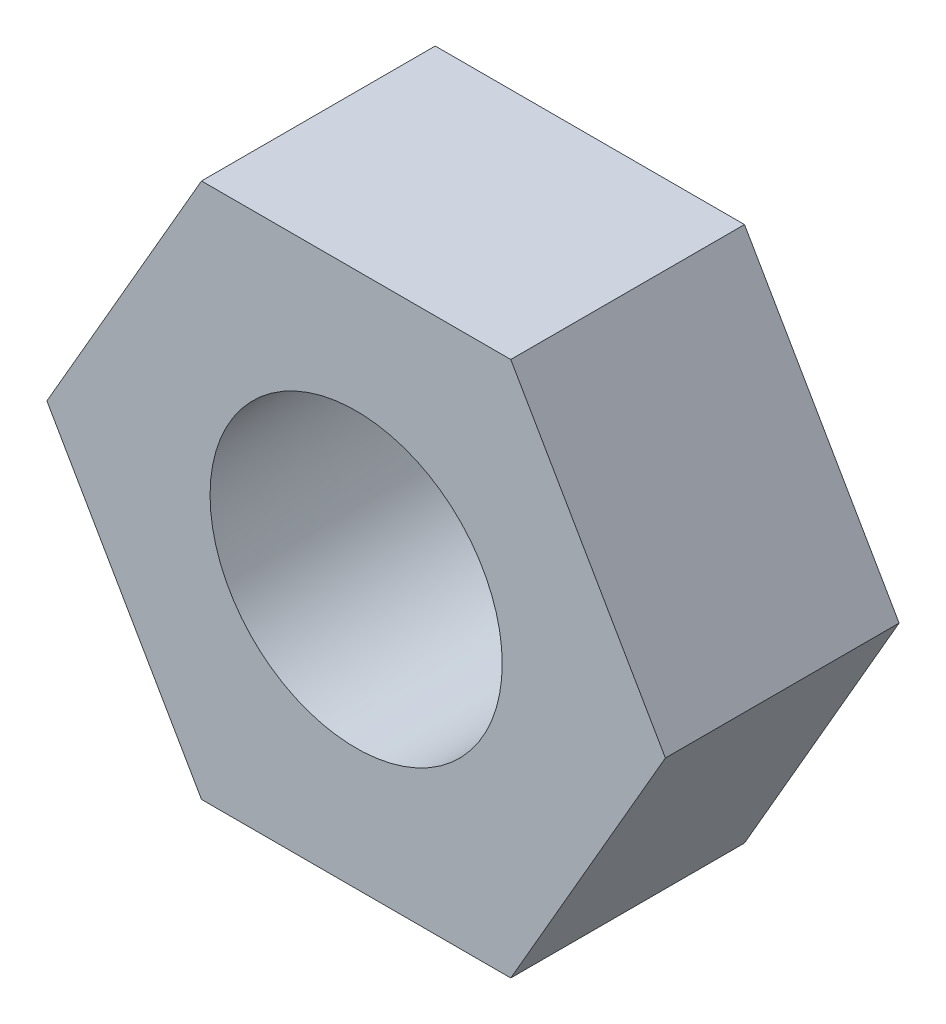
ISO-10303-21;
HEADER;
FILE_DESCRIPTION(('STEP AP214'),'2;1');
FILE_NAME('part.step','',(''),(''),'','','');
FILE_SCHEMA(('AUTOMOTIVE_DESIGN { 1 0 10303 214 1 1 1 1 }'));
ENDSEC;
DATA;
#1=APPLICATION_CONTEXT('core data for automotive mechanical design processes');
#2=APPLICATION_PROTOCOL_DEFINITION('international standard','automotive_design',2000,#1);
#3=PRODUCT_CONTEXT('',#1,'mechanical');
#4=PRODUCT('Part','Part','',(#3));
#5=PRODUCT_RELATED_PRODUCT_CATEGORY('part','',(#4));
#6=PRODUCT_DEFINITION_FORMATION('','',#4);
#7=PRODUCT_DEFINITION_CONTEXT('part definition',#1,'design');
#8=PRODUCT_DEFINITION('design','',#6,#7);
#9=PRODUCT_DEFINITION_SHAPE('','',#8);
#10=(LENGTH_UNIT() NAMED_UNIT(*) SI_UNIT(.MILLI.,.METRE.));
#11=(NAMED_UNIT(*) PLANE_ANGLE_UNIT() SI_UNIT($,.RADIAN.));
#12=(NAMED_UNIT(*) SI_UNIT($,.STERADIAN.) SOLID_ANGLE_UNIT());
#13=UNCERTAINTY_MEASURE_WITH_UNIT(LENGTH_MEASURE(1.E-05),#10,'distance_accuracy_value','');
#14=(GEOMETRIC_REPRESENTATION_CONTEXT(3) GLOBAL_UNCERTAINTY_ASSIGNED_CONTEXT((#13)) GLOBAL_UNIT_ASSIGNED_CONTEXT((#10,
#11,#12)) REPRESENTATION_CONTEXT('',''));
#15=CARTESIAN_POINT('',(0.,0.,0.));
#16=DIRECTION('',(0.,0.,1.));
#17=DIRECTION('',(1.,0.,0.));
#18=AXIS2_PLACEMENT_3D('',#15,#16,#17);
#19=CARTESIAN_POINT('',(0.,0.,2.4));
#20=DIRECTION('',(0.,0.,1.));
#21=DIRECTION('',(1.,0.,0.));
#22=AXIS2_PLACEMENT_3D('',#19,#20,#21);
#23=PLANE('',#22);
#24=DIRECTION('',(0.5,0.866025403784439,0.));
#25=VECTOR('',#24,1.);
#26=CARTESIAN_POINT('',(1.58771324027147,-2.75,2.4));
#27=LINE('',#26,#25);
#28=CARTESIAN_POINT('',(1.58771324027147,-2.75,2.4));
#29=VERTEX_POINT('',#28);
#30=CARTESIAN_POINT('',(3.17542648054294,0.,2.4));
#31=VERTEX_POINT('',#30);
#32=EDGE_CURVE('E134',#29,#31,#27,.T.);
#33=ORIENTED_EDGE('',*,*,#32,.T.);
#34=DIRECTION('',(-0.5,0.866025403784439,0.));
#35=VECTOR('',#34,1.);
#36=CARTESIAN_POINT('',(3.17542648054294,0.,2.4));
#37=LINE('',#36,#35);
#38=CARTESIAN_POINT('',(1.58771324027147,2.75,2.4));
#39=VERTEX_POINT('',#38);
#40=EDGE_CURVE('E93',#31,#39,#37,.T.);
#41=ORIENTED_EDGE('',*,*,#40,.T.);
#42=DIRECTION('',(-1.,0.,0.));
#43=VECTOR('',#42,1.);
#44=CARTESIAN_POINT('',(1.58771324027147,2.75,2.4));
#45=LINE('',#44,#43);
#46=CARTESIAN_POINT('',(-1.58771324027147,2.75,2.4));
#47=VERTEX_POINT('',#46);
#48=EDGE_CURVE('E106',#39,#47,#45,.T.);
#49=ORIENTED_EDGE('',*,*,#48,.T.);
#50=DIRECTION('',(-0.5,-0.866025403784438,0.));
#51=VECTOR('',#50,1.);
#52=CARTESIAN_POINT('',(-1.58771324027147,2.75,2.4));
#53=LINE('',#52,#51);
#54=CARTESIAN_POINT('',(-3.17542648054294,0.,2.4));
#55=VERTEX_POINT('',#54);
#56=EDGE_CURVE('E99',#47,#55,#53,.T.);
#57=ORIENTED_EDGE('',*,*,#56,.T.);
#58=DIRECTION('',(0.5,-0.866025403784439,0.));
#59=VECTOR('',#58,1.);
#60=CARTESIAN_POINT('',(-3.17542648054294,0.,2.4));
#61=LINE('',#60,#59);
#62=CARTESIAN_POINT('',(-1.58771324027147,-2.75,2.4));
#63=VERTEX_POINT('',#62);
#64=EDGE_CURVE('E101',#55,#63,#61,.T.);
#65=ORIENTED_EDGE('',*,*,#64,.T.);
#66=DIRECTION('',(1.,0.,0.));
#67=VECTOR('',#66,1.);
#68=CARTESIAN_POINT('',(-1.58771324027147,-2.75,2.4));
#69=LINE('',#68,#67);
#70=EDGE_CURVE('E57',#63,#29,#69,.T.);
#71=ORIENTED_EDGE('',*,*,#70,.T.);
#72=EDGE_LOOP('',(#33,#41,#49,#57,#65,#71));
#73=FACE_BOUND('',#72,.T.);
#74=CARTESIAN_POINT('',(0.,0.,2.4));
#75=DIRECTION('',(0.,0.,1.));
#76=DIRECTION('',(1.,0.,0.));
#77=AXIS2_PLACEMENT_3D('',#74,#75,#76);
#78=CIRCLE('',#77,1.5);
#79=CARTESIAN_POINT('',(1.5,0.,2.4));
#80=VERTEX_POINT('',#79);
#81=EDGE_CURVE('E126',#80,#80,#78,.T.);
#82=ORIENTED_EDGE('',*,*,#81,.F.);
#83=EDGE_LOOP('',(#82));
#84=FACE_BOUND('',#83,.T.);
#85=ADVANCED_FACE('F39',(#73,#84),#23,.T.);
#86=CARTESIAN_POINT('',(0.,0.,0.));
#87=DIRECTION('',(0.,0.,1.));
#88=DIRECTION('',(1.,0.,0.));
#89=AXIS2_PLACEMENT_3D('',#86,#87,#88);
#90=PLANE('',#89);
#91=DIRECTION('',(0.5,0.866025403784439,0.));
#92=VECTOR('',#91,1.);
#93=CARTESIAN_POINT('',(1.58771324027147,-2.75,0.));
#94=LINE('',#93,#92);
#95=CARTESIAN_POINT('',(1.58771324027147,-2.75,0.));
#96=VERTEX_POINT('',#95);
#97=CARTESIAN_POINT('',(3.17542648054294,0.,0.));
#98=VERTEX_POINT('',#97);
#99=EDGE_CURVE('E125',#96,#98,#94,.T.);
#100=ORIENTED_EDGE('',*,*,#99,.F.);
#101=DIRECTION('',(1.,0.,0.));
#102=VECTOR('',#101,1.);
#103=CARTESIAN_POINT('',(-1.58771324027147,-2.75,0.));
#104=LINE('',#103,#102);
#105=CARTESIAN_POINT('',(-1.58771324027147,-2.75,0.));
#106=VERTEX_POINT('',#105);
#107=EDGE_CURVE('E82',#106,#96,#104,.T.);
#108=ORIENTED_EDGE('',*,*,#107,.F.);
#109=DIRECTION('',(0.5,-0.866025403784439,0.));
#110=VECTOR('',#109,1.);
#111=CARTESIAN_POINT('',(-3.17542648054294,0.,0.));
#112=LINE('',#111,#110);
#113=CARTESIAN_POINT('',(-3.17542648054294,0.,0.));
#114=VERTEX_POINT('',#113);
#115=EDGE_CURVE('E80',#114,#106,#112,.T.);
#116=ORIENTED_EDGE('',*,*,#115,.F.);
#117=DIRECTION('',(-0.5,-0.866025403784438,0.));
#118=VECTOR('',#117,1.);
#119=CARTESIAN_POINT('',(-1.58771324027147,2.75,0.));
#120=LINE('',#119,#118);
#121=CARTESIAN_POINT('',(-1.58771324027147,2.75,0.));
#122=VERTEX_POINT('',#121);
#123=EDGE_CURVE('E114',#122,#114,#120,.T.);
#124=ORIENTED_EDGE('',*,*,#123,.F.);
#125=DIRECTION('',(-1.,0.,0.));
#126=VECTOR('',#125,1.);
#127=CARTESIAN_POINT('',(1.58771324027147,2.75,0.));
#128=LINE('',#127,#126);
#129=CARTESIAN_POINT('',(1.58771324027147,2.75,0.));
#130=VERTEX_POINT('',#129);
#131=EDGE_CURVE('E127',#130,#122,#128,.T.);
#132=ORIENTED_EDGE('',*,*,#131,.F.);
#133=DIRECTION('',(-0.5,0.866025403784439,0.));
#134=VECTOR('',#133,1.);
#135=CARTESIAN_POINT('',(3.17542648054294,0.,0.));
#136=LINE('',#135,#134);
#137=EDGE_CURVE('E130',#98,#130,#136,.T.);
#138=ORIENTED_EDGE('',*,*,#137,.F.);
#139=EDGE_LOOP('',(#100,#108,#116,#124,#132,#138));
#140=FACE_BOUND('',#139,.T.);
#141=CARTESIAN_POINT('',(0.,0.,0.));
#142=DIRECTION('',(0.,0.,1.));
#143=DIRECTION('',(1.,0.,0.));
#144=AXIS2_PLACEMENT_3D('',#141,#142,#143);
#145=CIRCLE('',#144,1.5);
#146=CARTESIAN_POINT('',(1.5,0.,0.));
#147=VERTEX_POINT('',#146);
#148=EDGE_CURVE('E228',#147,#147,#145,.T.);
#149=ORIENTED_EDGE('',*,*,#148,.T.);
#150=EDGE_LOOP('',(#149));
#151=FACE_BOUND('',#150,.T.);
#152=ADVANCED_FACE('F143',(#140,#151),#90,.F.);
#153=CARTESIAN_POINT('',(1.58771324027147,-2.75,2.4));
#154=DIRECTION('',(-0.866025403784439,0.5,0.));
#155=DIRECTION('',(-0.5,-0.866025403784439,0.));
#156=AXIS2_PLACEMENT_3D('',#153,#154,#155);
#157=PLANE('',#156);
#158=ORIENTED_EDGE('',*,*,#99,.T.);
#159=DIRECTION('',(0.,0.,-1.));
#160=VECTOR('',#159,1.);
#161=CARTESIAN_POINT('',(3.17542648054294,0.,2.4));
#162=LINE('',#161,#160);
#163=EDGE_CURVE('E11',#31,#98,#162,.T.);
#164=ORIENTED_EDGE('',*,*,#163,.F.);
#165=ORIENTED_EDGE('',*,*,#32,.F.);
#166=DIRECTION('',(0.,0.,-1.));
#167=VECTOR('',#166,1.);
#168=CARTESIAN_POINT('',(1.58771324027147,-2.75,2.4));
#169=LINE('',#168,#167);
#170=EDGE_CURVE('E120',#29,#96,#169,.T.);
#171=ORIENTED_EDGE('',*,*,#170,.T.);
#172=EDGE_LOOP('',(#158,#164,#165,#171));
#173=FACE_BOUND('',#172,.T.);
#174=ADVANCED_FACE('F41',(#173),#157,.F.);
#175=CARTESIAN_POINT('',(3.17542648054294,0.,2.4));
#176=DIRECTION('',(-0.866025403784439,-0.5,0.));
#177=DIRECTION('',(0.5,-0.866025403784439,0.));
#178=AXIS2_PLACEMENT_3D('',#175,#176,#177);
#179=PLANE('',#178);
#180=ORIENTED_EDGE('',*,*,#137,.T.);
#181=DIRECTION('',(0.,0.,-1.));
#182=VECTOR('',#181,1.);
#183=CARTESIAN_POINT('',(1.58771324027147,2.75,2.4));
#184=LINE('',#183,#182);
#185=EDGE_CURVE('E48',#39,#130,#184,.T.);
#186=ORIENTED_EDGE('',*,*,#185,.F.);
#187=ORIENTED_EDGE('',*,*,#40,.F.);
#188=ORIENTED_EDGE('',*,*,#163,.T.);
#189=EDGE_LOOP('',(#180,#186,#187,#188));
#190=FACE_BOUND('',#189,.T.);
#191=ADVANCED_FACE('F170',(#190),#179,.F.);
#192=CARTESIAN_POINT('',(1.58771324027147,2.75,2.4));
#193=DIRECTION('',(0.,-1.,0.));
#194=DIRECTION('',(1.,0.,0.));
#195=AXIS2_PLACEMENT_3D('',#192,#193,#194);
#196=PLANE('',#195);
#197=ORIENTED_EDGE('',*,*,#131,.T.);
#198=DIRECTION('',(0.,0.,-1.));
#199=VECTOR('',#198,1.);
#200=CARTESIAN_POINT('',(-1.58771324027147,2.75,2.4));
#201=LINE('',#200,#199);
#202=EDGE_CURVE('E113',#47,#122,#201,.T.);
#203=ORIENTED_EDGE('',*,*,#202,.F.);
#204=ORIENTED_EDGE('',*,*,#48,.F.);
#205=ORIENTED_EDGE('',*,*,#185,.T.);
#206=EDGE_LOOP('',(#197,#203,#204,#205));
#207=FACE_BOUND('',#206,.T.);
#208=ADVANCED_FACE('F141',(#207),#196,.F.);
#209=CARTESIAN_POINT('',(-1.58771324027147,2.75,2.4));
#210=DIRECTION('',(0.866025403784439,-0.5,0.));
#211=DIRECTION('',(0.5,0.866025403784439,0.));
#212=AXIS2_PLACEMENT_3D('',#209,#210,#211);
#213=PLANE('',#212);
#214=ORIENTED_EDGE('',*,*,#123,.T.);
#215=DIRECTION('',(0.,0.,-1.));
#216=VECTOR('',#215,1.);
#217=CARTESIAN_POINT('',(-3.17542648054294,0.,2.4));
#218=LINE('',#217,#216);
#219=EDGE_CURVE('E112',#55,#114,#218,.T.);
#220=ORIENTED_EDGE('',*,*,#219,.F.);
#221=ORIENTED_EDGE('',*,*,#56,.F.);
#222=ORIENTED_EDGE('',*,*,#202,.T.);
#223=EDGE_LOOP('',(#214,#220,#221,#222));
#224=FACE_BOUND('',#223,.T.);
#225=ADVANCED_FACE('F115',(#224),#213,.F.);
#226=CARTESIAN_POINT('',(-3.17542648054294,0.,2.4));
#227=DIRECTION('',(0.866025403784439,0.5,0.));
#228=DIRECTION('',(-0.5,0.866025403784439,0.));
#229=AXIS2_PLACEMENT_3D('',#226,#227,#228);
#230=PLANE('',#229);
#231=ORIENTED_EDGE('',*,*,#115,.T.);
#232=DIRECTION('',(0.,0.,-1.));
#233=VECTOR('',#232,1.);
#234=CARTESIAN_POINT('',(-1.58771324027147,-2.75,2.4));
#235=LINE('',#234,#233);
#236=EDGE_CURVE('E116',#63,#106,#235,.T.);
#237=ORIENTED_EDGE('',*,*,#236,.F.);
#238=ORIENTED_EDGE('',*,*,#64,.F.);
#239=ORIENTED_EDGE('',*,*,#219,.T.);
#240=EDGE_LOOP('',(#231,#237,#238,#239));
#241=FACE_BOUND('',#240,.T.);
#242=ADVANCED_FACE('F119',(#241),#230,.F.);
#243=CARTESIAN_POINT('',(-1.58771324027147,-2.75,2.4));
#244=DIRECTION('',(0.,1.,0.));
#245=DIRECTION('',(-1.,0.,0.));
#246=AXIS2_PLACEMENT_3D('',#243,#244,#245);
#247=PLANE('',#246);
#248=ORIENTED_EDGE('',*,*,#107,.T.);
#249=ORIENTED_EDGE('',*,*,#170,.F.);
#250=ORIENTED_EDGE('',*,*,#70,.F.);
#251=ORIENTED_EDGE('',*,*,#236,.T.);
#252=EDGE_LOOP('',(#248,#249,#250,#251));
#253=FACE_BOUND('',#252,.T.);
#254=ADVANCED_FACE('F146',(#253),#247,.F.);
#255=CARTESIAN_POINT('',(0.,0.,2.4));
#256=DIRECTION('',(0.,0.,-1.));
#257=DIRECTION('',(-1.,0.,0.));
#258=AXIS2_PLACEMENT_3D('',#255,#256,#257);
#259=CYLINDRICAL_SURFACE('',#258,1.5);
#260=ORIENTED_EDGE('',*,*,#81,.T.);
#261=EDGE_LOOP('',(#260));
#262=FACE_BOUND('',#261,.T.);
#263=ORIENTED_EDGE('',*,*,#148,.F.);
#264=EDGE_LOOP('',(#263));
#265=FACE_BOUND('',#264,.T.);
#266=ADVANCED_FACE('F151',(#262,#265),#259,.F.);
#267=CLOSED_SHELL('',(#85,#152,#174,#191,#208,#225,#242,#254,#266));
#268=MANIFOLD_SOLID_BREP('B2',#267);
#269=ADVANCED_BREP_SHAPE_REPRESENTATION('',(#18,#268),#14);
#270=SHAPE_DEFINITION_REPRESENTATION(#9,#269);
ENDSEC;
END-ISO-10303-21;
